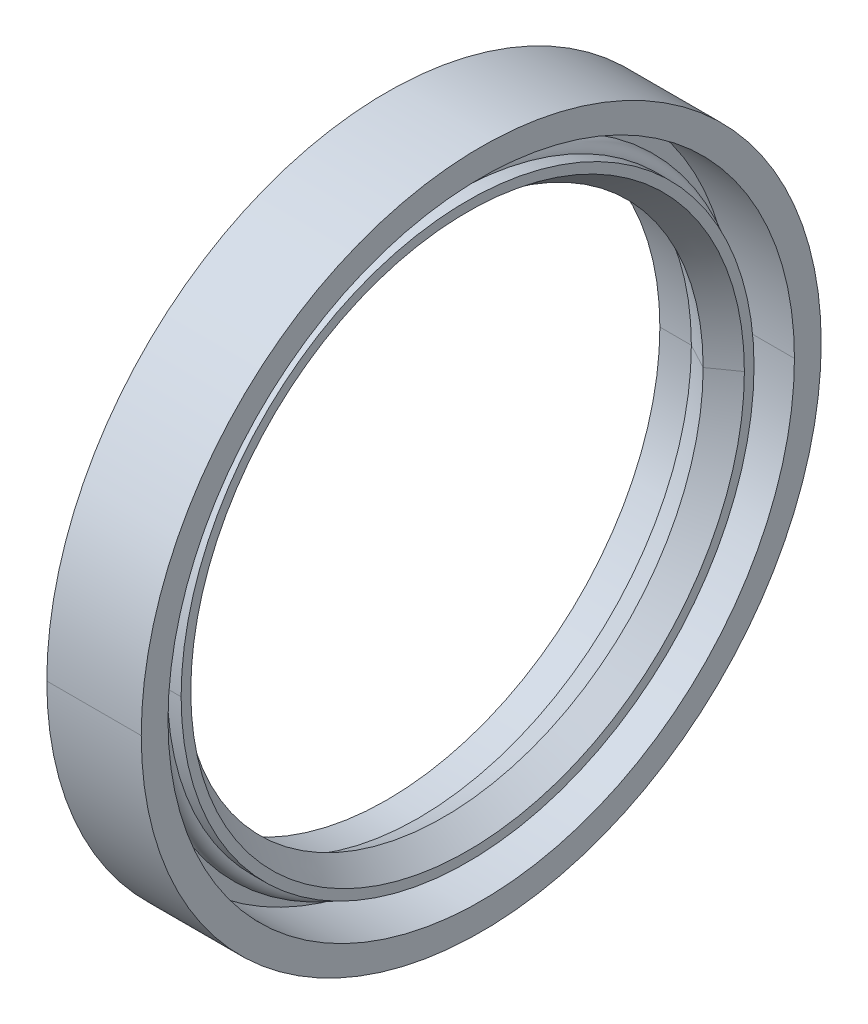
ISO-10303-21;
HEADER;
FILE_DESCRIPTION(('STEP AP214'),'2;1');
FILE_NAME('part.step','',(''),(''),'','','');
FILE_SCHEMA(('AUTOMOTIVE_DESIGN { 1 0 10303 214 1 1 1 1 }'));
ENDSEC;
DATA;
#1=APPLICATION_CONTEXT('core data for automotive mechanical design processes');
#2=APPLICATION_PROTOCOL_DEFINITION('international standard','automotive_design',2000,#1);
#3=PRODUCT_CONTEXT('',#1,'mechanical');
#4=PRODUCT('Part','Part','',(#3));
#5=PRODUCT_RELATED_PRODUCT_CATEGORY('part','',(#4));
#6=PRODUCT_DEFINITION_FORMATION('','',#4);
#7=PRODUCT_DEFINITION_CONTEXT('part definition',#1,'design');
#8=PRODUCT_DEFINITION('design','',#6,#7);
#9=PRODUCT_DEFINITION_SHAPE('','',#8);
#10=(LENGTH_UNIT() NAMED_UNIT(*) SI_UNIT(.MILLI.,.METRE.));
#11=(NAMED_UNIT(*) PLANE_ANGLE_UNIT() SI_UNIT($,.RADIAN.));
#12=(NAMED_UNIT(*) SI_UNIT($,.STERADIAN.) SOLID_ANGLE_UNIT());
#13=UNCERTAINTY_MEASURE_WITH_UNIT(LENGTH_MEASURE(1.E-05),#10,'distance_accuracy_value','');
#14=(GEOMETRIC_REPRESENTATION_CONTEXT(3) GLOBAL_UNCERTAINTY_ASSIGNED_CONTEXT((#13)) GLOBAL_UNIT_ASSIGNED_CONTEXT((#10,
#11,#12)) REPRESENTATION_CONTEXT('',''));
#15=CARTESIAN_POINT('',(0.,0.,0.));
#16=DIRECTION('',(0.,0.,1.));
#17=DIRECTION('',(1.,0.,0.));
#18=AXIS2_PLACEMENT_3D('',#15,#16,#17);
#19=CARTESIAN_POINT('',(10.,0.,0.));
#20=DIRECTION('',(1.,0.,0.));
#21=DIRECTION('',(0.,1.,0.));
#22=AXIS2_PLACEMENT_3D('',#19,#20,#21);
#23=CYLINDRICAL_SURFACE('',#22,36.);
#24=DIRECTION('',(1.,0.,0.));
#25=VECTOR('',#24,1.);
#26=CARTESIAN_POINT('',(0.,0.,36.));
#27=LINE('',#26,#25);
#28=CARTESIAN_POINT('',(0.,0.,36.));
#29=VERTEX_POINT('',#28);
#30=CARTESIAN_POINT('',(10.,0.,36.));
#31=VERTEX_POINT('',#30);
#32=EDGE_CURVE('E11',#29,#31,#27,.T.);
#33=ORIENTED_EDGE('',*,*,#32,.F.);
#34=CARTESIAN_POINT('',(0.,0.,0.));
#35=DIRECTION('',(1.,0.,0.));
#36=DIRECTION('',(0.,0.,-1.));
#37=AXIS2_PLACEMENT_3D('',#34,#35,#36);
#38=CIRCLE('',#37,36.);
#39=CARTESIAN_POINT('',(0.,0.,-36.));
#40=VERTEX_POINT('',#39);
#41=EDGE_CURVE('E25',#29,#40,#38,.T.);
#42=ORIENTED_EDGE('',*,*,#41,.T.);
#43=DIRECTION('',(1.,0.,0.));
#44=VECTOR('',#43,1.);
#45=CARTESIAN_POINT('',(0.,0.,-36.));
#46=LINE('',#45,#44);
#47=CARTESIAN_POINT('',(10.,0.,-36.));
#48=VERTEX_POINT('',#47);
#49=EDGE_CURVE('E320',#40,#48,#46,.T.);
#50=ORIENTED_EDGE('',*,*,#49,.T.);
#51=CARTESIAN_POINT('',(10.,0.,0.));
#52=DIRECTION('',(1.,0.,0.));
#53=DIRECTION('',(0.,0.,-1.));
#54=AXIS2_PLACEMENT_3D('',#51,#52,#53);
#55=CIRCLE('',#54,36.);
#56=EDGE_CURVE('E315',#31,#48,#55,.T.);
#57=ORIENTED_EDGE('',*,*,#56,.F.);
#58=EDGE_LOOP('',(#33,#42,#50,#57));
#59=FACE_BOUND('',#58,.T.);
#60=ADVANCED_FACE('F17',(#59),#23,.T.);
#61=CARTESIAN_POINT('',(10.,33.166666666667,0.));
#62=DIRECTION('',(1.,0.,0.));
#63=DIRECTION('',(0.,0.,-1.));
#64=AXIS2_PLACEMENT_3D('',#61,#62,#63);
#65=PLANE('',#64);
#66=CARTESIAN_POINT('',(10.,0.,0.));
#67=DIRECTION('',(1.,0.,0.));
#68=DIRECTION('',(0.,0.,-1.));
#69=AXIS2_PLACEMENT_3D('',#66,#67,#68);
#70=CIRCLE('',#69,36.);
#71=EDGE_CURVE('E310',#48,#31,#70,.T.);
#72=ORIENTED_EDGE('',*,*,#71,.T.);
#73=ORIENTED_EDGE('',*,*,#56,.T.);
#74=EDGE_LOOP('',(#72,#73));
#75=FACE_BOUND('',#74,.T.);
#76=CARTESIAN_POINT('',(10.,0.,0.));
#77=DIRECTION('',(1.,0.,0.));
#78=DIRECTION('',(0.,0.,-1.));
#79=AXIS2_PLACEMENT_3D('',#76,#77,#78);
#80=CIRCLE('',#79,33.166666666667);
#81=CARTESIAN_POINT('',(10.,0.,33.166666666667));
#82=VERTEX_POINT('',#81);
#83=CARTESIAN_POINT('',(10.,0.,-33.166666666667));
#84=VERTEX_POINT('',#83);
#85=EDGE_CURVE('E305',#82,#84,#80,.T.);
#86=ORIENTED_EDGE('',*,*,#85,.F.);
#87=CARTESIAN_POINT('',(10.,0.,0.));
#88=DIRECTION('',(1.,0.,0.));
#89=DIRECTION('',(0.,0.,-1.));
#90=AXIS2_PLACEMENT_3D('',#87,#88,#89);
#91=CIRCLE('',#90,33.166666666667);
#92=EDGE_CURVE('E300',#84,#82,#91,.T.);
#93=ORIENTED_EDGE('',*,*,#92,.F.);
#94=EDGE_LOOP('',(#86,#93));
#95=FACE_BOUND('',#94,.T.);
#96=ADVANCED_FACE('F333',(#75,#95),#65,.T.);
#97=CARTESIAN_POINT('',(10.,0.,0.));
#98=DIRECTION('',(1.,0.,0.));
#99=DIRECTION('',(0.,-1.,0.));
#100=AXIS2_PLACEMENT_3D('',#97,#98,#99);
#101=CYLINDRICAL_SURFACE('',#100,33.166666666667);
#102=DIRECTION('',(1.,0.,0.));
#103=VECTOR('',#102,1.);
#104=CARTESIAN_POINT('',(3.3333333333333,0.,33.166666666667));
#105=LINE('',#104,#103);
#106=CARTESIAN_POINT('',(3.3333333333333,0.,33.166666666667));
#107=VERTEX_POINT('',#106);
#108=EDGE_CURVE('E295',#107,#82,#105,.T.);
#109=ORIENTED_EDGE('',*,*,#108,.F.);
#110=CARTESIAN_POINT('',(3.3333333333333,0.,0.));
#111=DIRECTION('',(1.,0.,0.));
#112=DIRECTION('',(0.,0.,-1.));
#113=AXIS2_PLACEMENT_3D('',#110,#111,#112);
#114=CIRCLE('',#113,33.166666666667);
#115=CARTESIAN_POINT('',(3.3333333333333,0.,-33.166666666667));
#116=VERTEX_POINT('',#115);
#117=EDGE_CURVE('E290',#116,#107,#114,.T.);
#118=ORIENTED_EDGE('',*,*,#117,.F.);
#119=DIRECTION('',(1.,0.,0.));
#120=VECTOR('',#119,1.);
#121=CARTESIAN_POINT('',(3.3333333333333,0.,-33.166666666667));
#122=LINE('',#121,#120);
#123=EDGE_CURVE('E285',#116,#84,#122,.T.);
#124=ORIENTED_EDGE('',*,*,#123,.T.);
#125=ORIENTED_EDGE('',*,*,#92,.T.);
#126=EDGE_LOOP('',(#109,#118,#124,#125));
#127=FACE_BOUND('',#126,.T.);
#128=ADVANCED_FACE('F336',(#127),#101,.F.);
#129=CARTESIAN_POINT('',(10.,0.,0.));
#130=DIRECTION('',(1.,0.,0.));
#131=DIRECTION('',(0.,1.,0.));
#132=AXIS2_PLACEMENT_3D('',#129,#130,#131);
#133=CYLINDRICAL_SURFACE('',#132,33.166666666667);
#134=ORIENTED_EDGE('',*,*,#108,.T.);
#135=ORIENTED_EDGE('',*,*,#85,.T.);
#136=ORIENTED_EDGE('',*,*,#123,.F.);
#137=CARTESIAN_POINT('',(3.3333333333333,0.,0.));
#138=DIRECTION('',(1.,0.,0.));
#139=DIRECTION('',(0.,0.,-1.));
#140=AXIS2_PLACEMENT_3D('',#137,#138,#139);
#141=CIRCLE('',#140,33.166666666667);
#142=EDGE_CURVE('E280',#107,#116,#141,.T.);
#143=ORIENTED_EDGE('',*,*,#142,.F.);
#144=EDGE_LOOP('',(#134,#135,#136,#143));
#145=FACE_BOUND('',#144,.T.);
#146=ADVANCED_FACE('F340',(#145),#133,.F.);
#147=CARTESIAN_POINT('',(3.3333333333333,30.333333333333,0.));
#148=DIRECTION('',(1.,0.,0.));
#149=DIRECTION('',(0.,0.,-1.));
#150=AXIS2_PLACEMENT_3D('',#147,#148,#149);
#151=PLANE('',#150);
#152=ORIENTED_EDGE('',*,*,#117,.T.);
#153=ORIENTED_EDGE('',*,*,#142,.T.);
#154=EDGE_LOOP('',(#152,#153));
#155=FACE_BOUND('',#154,.T.);
#156=CARTESIAN_POINT('',(3.3333333333333,0.,0.));
#157=DIRECTION('',(1.,0.,0.));
#158=DIRECTION('',(0.,0.,-1.));
#159=AXIS2_PLACEMENT_3D('',#156,#157,#158);
#160=CIRCLE('',#159,30.333333333333);
#161=CARTESIAN_POINT('',(3.3333333333333,0.,30.333333333333));
#162=VERTEX_POINT('',#161);
#163=CARTESIAN_POINT('',(3.3333333333333,0.,-30.333333333333));
#164=VERTEX_POINT('',#163);
#165=EDGE_CURVE('E275',#162,#164,#160,.T.);
#166=ORIENTED_EDGE('',*,*,#165,.F.);
#167=CARTESIAN_POINT('',(3.3333333333333,0.,0.));
#168=DIRECTION('',(1.,0.,0.));
#169=DIRECTION('',(0.,0.,-1.));
#170=AXIS2_PLACEMENT_3D('',#167,#168,#169);
#171=CIRCLE('',#170,30.333333333333);
#172=EDGE_CURVE('E270',#164,#162,#171,.T.);
#173=ORIENTED_EDGE('',*,*,#172,.F.);
#174=EDGE_LOOP('',(#166,#173));
#175=FACE_BOUND('',#174,.T.);
#176=ADVANCED_FACE('F343',(#155,#175),#151,.T.);
#177=CARTESIAN_POINT('',(10.,0.,0.));
#178=DIRECTION('',(1.,0.,0.));
#179=DIRECTION('',(0.,-1.,0.));
#180=AXIS2_PLACEMENT_3D('',#177,#178,#179);
#181=CYLINDRICAL_SURFACE('',#180,30.333333333333);
#182=DIRECTION('',(1.,0.,0.));
#183=VECTOR('',#182,1.);
#184=CARTESIAN_POINT('',(3.3333333333333,0.,30.333333333333));
#185=LINE('',#184,#183);
#186=CARTESIAN_POINT('',(4.888889,0.,30.333333333333));
#187=VERTEX_POINT('',#186);
#188=EDGE_CURVE('E266',#162,#187,#185,.T.);
#189=ORIENTED_EDGE('',*,*,#188,.T.);
#190=CARTESIAN_POINT('',(4.888889,0.,0.));
#191=DIRECTION('',(1.,0.,0.));
#192=DIRECTION('',(0.,0.,-1.));
#193=AXIS2_PLACEMENT_3D('',#190,#191,#192);
#194=CIRCLE('',#193,30.333333333333);
#195=CARTESIAN_POINT('',(4.888889,28.8487143276193,9.37351549603997));
#196=VERTEX_POINT('',#195);
#197=EDGE_CURVE('E261',#196,#187,#194,.T.);
#198=ORIENTED_EDGE('',*,*,#197,.F.);
#199=CARTESIAN_POINT('',(4.888889,0.,0.));
#200=DIRECTION('',(1.,0.,0.));
#201=DIRECTION('',(0.,0.,-1.));
#202=AXIS2_PLACEMENT_3D('',#199,#200,#201);
#203=CIRCLE('',#202,30.333333333333);
#204=CARTESIAN_POINT('',(4.888889,0.,-30.333333333333));
#205=VERTEX_POINT('',#204);
#206=EDGE_CURVE('E256',#205,#196,#203,.T.);
#207=ORIENTED_EDGE('',*,*,#206,.F.);
#208=DIRECTION('',(1.,0.,0.));
#209=VECTOR('',#208,1.);
#210=CARTESIAN_POINT('',(3.3333333333333,0.,-30.333333333333));
#211=LINE('',#210,#209);
#212=EDGE_CURVE('E251',#164,#205,#211,.T.);
#213=ORIENTED_EDGE('',*,*,#212,.F.);
#214=ORIENTED_EDGE('',*,*,#172,.T.);
#215=EDGE_LOOP('',(#189,#198,#207,#213,#214));
#216=FACE_BOUND('',#215,.T.);
#217=ADVANCED_FACE('F346',(#216),#181,.T.);
#218=CARTESIAN_POINT('',(10.,0.,0.));
#219=DIRECTION('',(1.,0.,0.));
#220=DIRECTION('',(0.,1.,0.));
#221=AXIS2_PLACEMENT_3D('',#218,#219,#220);
#222=CYLINDRICAL_SURFACE('',#221,30.333333333333);
#223=ORIENTED_EDGE('',*,*,#188,.F.);
#224=ORIENTED_EDGE('',*,*,#165,.T.);
#225=ORIENTED_EDGE('',*,*,#212,.T.);
#226=CARTESIAN_POINT('',(4.888889,0.,0.));
#227=DIRECTION('',(1.,0.,0.));
#228=DIRECTION('',(0.,0.,-1.));
#229=AXIS2_PLACEMENT_3D('',#226,#227,#228);
#230=CIRCLE('',#229,30.333333333333);
#231=CARTESIAN_POINT('',(4.888889,-28.8487143276193,-9.37351549603996));
#232=VERTEX_POINT('',#231);
#233=EDGE_CURVE('E246',#232,#205,#230,.T.);
#234=ORIENTED_EDGE('',*,*,#233,.F.);
#235=CARTESIAN_POINT('',(4.888889,0.,0.));
#236=DIRECTION('',(1.,0.,0.));
#237=DIRECTION('',(0.,0.,-1.));
#238=AXIS2_PLACEMENT_3D('',#235,#236,#237);
#239=CIRCLE('',#238,30.333333333333);
#240=EDGE_CURVE('E241',#187,#232,#239,.T.);
#241=ORIENTED_EDGE('',*,*,#240,.F.);
#242=EDGE_LOOP('',(#223,#224,#225,#234,#241));
#243=FACE_BOUND('',#242,.T.);
#244=ADVANCED_FACE('F352',(#243),#222,.T.);
#245=CARTESIAN_POINT('',(6.,0.,0.));
#246=DIRECTION('',(1.,0.,0.));
#247=DIRECTION('',(0.,0.309016994374947,-0.951056516295154));
#248=AXIS2_PLACEMENT_3D('',#245,#246,#247);
#249=TOROIDAL_SURFACE('',#248,30.333333333333,1.111111);
#250=CARTESIAN_POINT('',(6.,-28.8487143276193,-9.37351549603996));
#251=DIRECTION('',(0.,0.309016994374947,-0.951056516295154));
#252=DIRECTION('',(1.,0.,0.));
#253=AXIS2_PLACEMENT_3D('',#250,#251,#252);
#254=CIRCLE('',#253,1.111111);
#255=CARTESIAN_POINT('',(7.111111,-28.8487143276193,-9.37351549603996));
#256=VERTEX_POINT('',#255);
#257=EDGE_CURVE('E236',#256,#232,#254,.T.);
#258=ORIENTED_EDGE('',*,*,#257,.F.);
#259=CARTESIAN_POINT('',(7.111111,0.,0.));
#260=DIRECTION('',(1.,0.,0.));
#261=DIRECTION('',(0.,0.,-1.));
#262=AXIS2_PLACEMENT_3D('',#259,#260,#261);
#263=CIRCLE('',#262,30.333333333333);
#264=CARTESIAN_POINT('',(7.111111,0.,30.333333333333));
#265=VERTEX_POINT('',#264);
#266=EDGE_CURVE('E231',#265,#256,#263,.T.);
#267=ORIENTED_EDGE('',*,*,#266,.F.);
#268=CARTESIAN_POINT('',(7.111111,0.,0.));
#269=DIRECTION('',(1.,0.,0.));
#270=DIRECTION('',(0.,0.,-1.));
#271=AXIS2_PLACEMENT_3D('',#268,#269,#270);
#272=CIRCLE('',#271,30.333333333333);
#273=CARTESIAN_POINT('',(7.111111,28.8487143276193,9.37351549603997));
#274=VERTEX_POINT('',#273);
#275=EDGE_CURVE('E226',#274,#265,#272,.T.);
#276=ORIENTED_EDGE('',*,*,#275,.F.);
#277=CARTESIAN_POINT('',(6.,28.8487143276193,9.37351549603997));
#278=DIRECTION('',(0.,-0.309016994374947,0.951056516295154));
#279=DIRECTION('',(1.,0.,0.));
#280=AXIS2_PLACEMENT_3D('',#277,#278,#279);
#281=CIRCLE('',#280,1.111111);
#282=EDGE_CURVE('E221',#274,#196,#281,.T.);
#283=ORIENTED_EDGE('',*,*,#282,.T.);
#284=ORIENTED_EDGE('',*,*,#197,.T.);
#285=ORIENTED_EDGE('',*,*,#240,.T.);
#286=EDGE_LOOP('',(#258,#267,#276,#283,#284,#285));
#287=FACE_BOUND('',#286,.T.);
#288=ADVANCED_FACE('F359',(#287),#249,.T.);
#289=CARTESIAN_POINT('',(6.,0.,0.));
#290=DIRECTION('',(1.,0.,0.));
#291=DIRECTION('',(0.,-0.309016994374947,0.951056516295154));
#292=AXIS2_PLACEMENT_3D('',#289,#290,#291);
#293=TOROIDAL_SURFACE('',#292,30.333333333333,1.111111);
#294=ORIENTED_EDGE('',*,*,#257,.T.);
#295=ORIENTED_EDGE('',*,*,#233,.T.);
#296=ORIENTED_EDGE('',*,*,#206,.T.);
#297=ORIENTED_EDGE('',*,*,#282,.F.);
#298=CARTESIAN_POINT('',(7.111111,0.,0.));
#299=DIRECTION('',(1.,0.,0.));
#300=DIRECTION('',(0.,0.,-1.));
#301=AXIS2_PLACEMENT_3D('',#298,#299,#300);
#302=CIRCLE('',#301,30.333333333333);
#303=CARTESIAN_POINT('',(7.111111,0.,-30.333333333333));
#304=VERTEX_POINT('',#303);
#305=EDGE_CURVE('E216',#304,#274,#302,.T.);
#306=ORIENTED_EDGE('',*,*,#305,.F.);
#307=CARTESIAN_POINT('',(7.111111,0.,0.));
#308=DIRECTION('',(1.,0.,0.));
#309=DIRECTION('',(0.,0.,-1.));
#310=AXIS2_PLACEMENT_3D('',#307,#308,#309);
#311=CIRCLE('',#310,30.333333333333);
#312=EDGE_CURVE('E211',#256,#304,#311,.T.);
#313=ORIENTED_EDGE('',*,*,#312,.F.);
#314=EDGE_LOOP('',(#294,#295,#296,#297,#306,#313));
#315=FACE_BOUND('',#314,.T.);
#316=ADVANCED_FACE('F355',(#315),#293,.T.);
#317=CARTESIAN_POINT('',(10.,0.,0.));
#318=DIRECTION('',(1.,0.,0.));
#319=DIRECTION('',(0.,1.,0.));
#320=AXIS2_PLACEMENT_3D('',#317,#318,#319);
#321=CYLINDRICAL_SURFACE('',#320,30.333333333333);
#322=DIRECTION('',(1.,0.,0.));
#323=VECTOR('',#322,1.);
#324=CARTESIAN_POINT('',(7.111111,0.,30.333333333333));
#325=LINE('',#324,#323);
#326=CARTESIAN_POINT('',(8.5555555,0.,30.333333333333));
#327=VERTEX_POINT('',#326);
#328=EDGE_CURVE('E206',#265,#327,#325,.T.);
#329=ORIENTED_EDGE('',*,*,#328,.F.);
#330=ORIENTED_EDGE('',*,*,#266,.T.);
#331=ORIENTED_EDGE('',*,*,#312,.T.);
#332=DIRECTION('',(1.,0.,0.));
#333=VECTOR('',#332,1.);
#334=CARTESIAN_POINT('',(7.111111,0.,-30.333333333333));
#335=LINE('',#334,#333);
#336=CARTESIAN_POINT('',(8.5555555,0.,-30.333333333333));
#337=VERTEX_POINT('',#336);
#338=EDGE_CURVE('E202',#304,#337,#335,.T.);
#339=ORIENTED_EDGE('',*,*,#338,.T.);
#340=CARTESIAN_POINT('',(8.5555555,0.,0.));
#341=DIRECTION('',(1.,0.,0.));
#342=DIRECTION('',(0.,0.,-1.));
#343=AXIS2_PLACEMENT_3D('',#340,#341,#342);
#344=CIRCLE('',#343,30.333333333333);
#345=EDGE_CURVE('E197',#327,#337,#344,.T.);
#346=ORIENTED_EDGE('',*,*,#345,.F.);
#347=EDGE_LOOP('',(#329,#330,#331,#339,#346));
#348=FACE_BOUND('',#347,.T.);
#349=ADVANCED_FACE('F364',(#348),#321,.T.);
#350=CARTESIAN_POINT('',(8.5555555,29.310185145833,0.));
#351=DIRECTION('',(1.,0.,0.));
#352=DIRECTION('',(0.,0.,-1.));
#353=AXIS2_PLACEMENT_3D('',#350,#351,#352);
#354=PLANE('',#353);
#355=CARTESIAN_POINT('',(8.5555555,0.,0.));
#356=DIRECTION('',(1.,0.,0.));
#357=DIRECTION('',(0.,0.,-1.));
#358=AXIS2_PLACEMENT_3D('',#355,#356,#357);
#359=CIRCLE('',#358,30.333333333333);
#360=EDGE_CURVE('E192',#337,#327,#359,.T.);
#361=ORIENTED_EDGE('',*,*,#360,.T.);
#362=ORIENTED_EDGE('',*,*,#345,.T.);
#363=EDGE_LOOP('',(#361,#362));
#364=FACE_BOUND('',#363,.T.);
#365=CARTESIAN_POINT('',(8.5555555,0.,0.));
#366=DIRECTION('',(1.,0.,0.));
#367=DIRECTION('',(0.,0.,-1.));
#368=AXIS2_PLACEMENT_3D('',#365,#366,#367);
#369=CIRCLE('',#368,29.310185145833);
#370=CARTESIAN_POINT('',(8.5555555,0.,29.310185145833));
#371=VERTEX_POINT('',#370);
#372=CARTESIAN_POINT('',(8.5555555,0.,-29.310185145833));
#373=VERTEX_POINT('',#372);
#374=EDGE_CURVE('E187',#371,#373,#369,.T.);
#375=ORIENTED_EDGE('',*,*,#374,.F.);
#376=CARTESIAN_POINT('',(8.5555555,0.,0.));
#377=DIRECTION('',(1.,0.,0.));
#378=DIRECTION('',(0.,0.,-1.));
#379=AXIS2_PLACEMENT_3D('',#376,#377,#378);
#380=CIRCLE('',#379,29.310185145833);
#381=EDGE_CURVE('E182',#373,#371,#380,.T.);
#382=ORIENTED_EDGE('',*,*,#381,.F.);
#383=EDGE_LOOP('',(#375,#382));
#384=FACE_BOUND('',#383,.T.);
#385=ADVANCED_FACE('F368',(#364,#384),#354,.T.);
#386=CARTESIAN_POINT('',(6.,0.,0.));
#387=DIRECTION('',(1.,0.,0.));
#388=DIRECTION('',(0.,-1.,0.));
#389=AXIS2_PLACEMENT_3D('',#386,#387,#388);
#390=CONICAL_SURFACE('',#389,27.5,0.616296937395985);
#391=DIRECTION('',(0.816024481101705,0.,0.578017340780268));
#392=VECTOR('',#391,1.);
#393=CARTESIAN_POINT('',(6.,0.,27.5));
#394=LINE('',#393,#392);
#395=CARTESIAN_POINT('',(6.,0.,27.5));
#396=VERTEX_POINT('',#395);
#397=EDGE_CURVE('E177',#396,#371,#394,.T.);
#398=ORIENTED_EDGE('',*,*,#397,.F.);
#399=CARTESIAN_POINT('',(6.,0.,0.));
#400=DIRECTION('',(1.,0.,0.));
#401=DIRECTION('',(0.,0.,-1.));
#402=AXIS2_PLACEMENT_3D('',#399,#400,#401);
#403=CIRCLE('',#402,27.5);
#404=CARTESIAN_POINT('',(6.,0.,-27.5));
#405=VERTEX_POINT('',#404);
#406=EDGE_CURVE('E172',#405,#396,#403,.T.);
#407=ORIENTED_EDGE('',*,*,#406,.F.);
#408=DIRECTION('',(0.816024481101705,0.,-0.578017340780268));
#409=VECTOR('',#408,1.);
#410=CARTESIAN_POINT('',(6.,0.,-27.5));
#411=LINE('',#410,#409);
#412=EDGE_CURVE('E167',#405,#373,#411,.T.);
#413=ORIENTED_EDGE('',*,*,#412,.T.);
#414=ORIENTED_EDGE('',*,*,#381,.T.);
#415=EDGE_LOOP('',(#398,#407,#413,#414));
#416=FACE_BOUND('',#415,.T.);
#417=ADVANCED_FACE('F371',(#416),#390,.F.);
#418=CARTESIAN_POINT('',(6.,0.,0.));
#419=DIRECTION('',(1.,0.,0.));
#420=DIRECTION('',(0.,1.,0.));
#421=AXIS2_PLACEMENT_3D('',#418,#419,#420);
#422=CONICAL_SURFACE('',#421,27.5,0.616296937395985);
#423=ORIENTED_EDGE('',*,*,#397,.T.);
#424=ORIENTED_EDGE('',*,*,#374,.T.);
#425=ORIENTED_EDGE('',*,*,#412,.F.);
#426=CARTESIAN_POINT('',(6.,0.,0.));
#427=DIRECTION('',(1.,0.,0.));
#428=DIRECTION('',(0.,0.,-1.));
#429=AXIS2_PLACEMENT_3D('',#426,#427,#428);
#430=CIRCLE('',#429,27.5);
#431=EDGE_CURVE('E162',#396,#405,#430,.T.);
#432=ORIENTED_EDGE('',*,*,#431,.F.);
#433=EDGE_LOOP('',(#423,#424,#425,#432));
#434=FACE_BOUND('',#433,.T.);
#435=ADVANCED_FACE('F376',(#434),#422,.F.);
#436=CARTESIAN_POINT('',(3.3333333333333,0.,0.));
#437=DIRECTION('',(-1.,0.,0.));
#438=DIRECTION('',(0.,1.,0.));
#439=AXIS2_PLACEMENT_3D('',#436,#437,#438);
#440=CONICAL_SURFACE('',#439,28.916666666667,0.488333951056498);
#441=DIRECTION('',(-0.883115719457367,0.,-0.469155225961831));
#442=VECTOR('',#441,1.);
#443=CARTESIAN_POINT('',(6.,0.,-27.5));
#444=LINE('',#443,#442);
#445=CARTESIAN_POINT('',(3.3333333333333,0.,-28.916666666667));
#446=VERTEX_POINT('',#445);
#447=EDGE_CURVE('E158',#405,#446,#444,.T.);
#448=ORIENTED_EDGE('',*,*,#447,.T.);
#449=CARTESIAN_POINT('',(3.3333333333333,0.,0.));
#450=DIRECTION('',(1.,0.,0.));
#451=DIRECTION('',(0.,0.,-1.));
#452=AXIS2_PLACEMENT_3D('',#449,#450,#451);
#453=CIRCLE('',#452,28.916666666667);
#454=CARTESIAN_POINT('',(3.3333333333333,0.,28.916666666667));
#455=VERTEX_POINT('',#454);
#456=EDGE_CURVE('E129',#455,#446,#453,.T.);
#457=ORIENTED_EDGE('',*,*,#456,.F.);
#458=DIRECTION('',(-0.883115719457367,0.,0.469155225961831));
#459=VECTOR('',#458,1.);
#460=CARTESIAN_POINT('',(6.,0.,27.5));
#461=LINE('',#460,#459);
#462=EDGE_CURVE('E150',#396,#455,#461,.T.);
#463=ORIENTED_EDGE('',*,*,#462,.F.);
#464=ORIENTED_EDGE('',*,*,#431,.T.);
#465=EDGE_LOOP('',(#448,#457,#463,#464));
#466=FACE_BOUND('',#465,.T.);
#467=ADVANCED_FACE('F381',(#466),#440,.F.);
#468=CARTESIAN_POINT('',(3.3333333333333,0.,0.));
#469=DIRECTION('',(-1.,0.,0.));
#470=DIRECTION('',(0.,-1.,0.));
#471=AXIS2_PLACEMENT_3D('',#468,#469,#470);
#472=CONICAL_SURFACE('',#471,28.916666666667,0.488333951056498);
#473=ORIENTED_EDGE('',*,*,#447,.F.);
#474=ORIENTED_EDGE('',*,*,#406,.T.);
#475=ORIENTED_EDGE('',*,*,#462,.T.);
#476=CARTESIAN_POINT('',(3.3333333333333,0.,0.));
#477=DIRECTION('',(1.,0.,0.));
#478=DIRECTION('',(0.,0.,-1.));
#479=AXIS2_PLACEMENT_3D('',#476,#477,#478);
#480=CIRCLE('',#479,28.916666666667);
#481=EDGE_CURVE('E146',#446,#455,#480,.T.);
#482=ORIENTED_EDGE('',*,*,#481,.F.);
#483=EDGE_LOOP('',(#473,#474,#475,#482));
#484=FACE_BOUND('',#483,.T.);
#485=ADVANCED_FACE('F384',(#484),#472,.F.);
#486=CARTESIAN_POINT('',(10.,0.,0.));
#487=DIRECTION('',(1.,0.,0.));
#488=DIRECTION('',(0.,-1.,0.));
#489=AXIS2_PLACEMENT_3D('',#486,#487,#488);
#490=CYLINDRICAL_SURFACE('',#489,28.916666666667);
#491=DIRECTION('',(1.,0.,0.));
#492=VECTOR('',#491,1.);
#493=CARTESIAN_POINT('',(0.,0.,28.916666666667));
#494=LINE('',#493,#492);
#495=CARTESIAN_POINT('',(0.,0.,28.916666666667));
#496=VERTEX_POINT('',#495);
#497=EDGE_CURVE('E121',#496,#455,#494,.T.);
#498=ORIENTED_EDGE('',*,*,#497,.F.);
#499=CARTESIAN_POINT('',(0.,0.,0.));
#500=DIRECTION('',(1.,0.,0.));
#501=DIRECTION('',(0.,0.,-1.));
#502=AXIS2_PLACEMENT_3D('',#499,#500,#501);
#503=CIRCLE('',#502,28.916666666667);
#504=CARTESIAN_POINT('',(0.,0.,-28.916666666667));
#505=VERTEX_POINT('',#504);
#506=EDGE_CURVE('E114',#505,#496,#503,.T.);
#507=ORIENTED_EDGE('',*,*,#506,.F.);
#508=DIRECTION('',(1.,0.,0.));
#509=VECTOR('',#508,1.);
#510=CARTESIAN_POINT('',(0.,0.,-28.916666666667));
#511=LINE('',#510,#509);
#512=EDGE_CURVE('E118',#505,#446,#511,.T.);
#513=ORIENTED_EDGE('',*,*,#512,.T.);
#514=ORIENTED_EDGE('',*,*,#481,.T.);
#515=EDGE_LOOP('',(#498,#507,#513,#514));
#516=FACE_BOUND('',#515,.T.);
#517=ADVANCED_FACE('F116',(#516),#490,.F.);
#518=CARTESIAN_POINT('',(10.,0.,0.));
#519=DIRECTION('',(1.,0.,0.));
#520=DIRECTION('',(0.,1.,0.));
#521=AXIS2_PLACEMENT_3D('',#518,#519,#520);
#522=CYLINDRICAL_SURFACE('',#521,28.916666666667);
#523=ORIENTED_EDGE('',*,*,#497,.T.);
#524=ORIENTED_EDGE('',*,*,#456,.T.);
#525=ORIENTED_EDGE('',*,*,#512,.F.);
#526=CARTESIAN_POINT('',(0.,0.,0.));
#527=DIRECTION('',(1.,0.,0.));
#528=DIRECTION('',(0.,0.,-1.));
#529=AXIS2_PLACEMENT_3D('',#526,#527,#528);
#530=CIRCLE('',#529,28.916666666667);
#531=EDGE_CURVE('E128',#496,#505,#530,.T.);
#532=ORIENTED_EDGE('',*,*,#531,.F.);
#533=EDGE_LOOP('',(#523,#524,#525,#532));
#534=FACE_BOUND('',#533,.T.);
#535=ADVANCED_FACE('F127',(#534),#522,.F.);
#536=CARTESIAN_POINT('',(0.,36.,0.));
#537=DIRECTION('',(-1.,0.,0.));
#538=DIRECTION('',(0.,0.,1.));
#539=AXIS2_PLACEMENT_3D('',#536,#537,#538);
#540=PLANE('',#539);
#541=ORIENTED_EDGE('',*,*,#506,.T.);
#542=ORIENTED_EDGE('',*,*,#531,.T.);
#543=EDGE_LOOP('',(#541,#542));
#544=FACE_BOUND('',#543,.T.);
#545=ORIENTED_EDGE('',*,*,#41,.F.);
#546=CARTESIAN_POINT('',(0.,0.,0.));
#547=DIRECTION('',(1.,0.,0.));
#548=DIRECTION('',(0.,0.,-1.));
#549=AXIS2_PLACEMENT_3D('',#546,#547,#548);
#550=CIRCLE('',#549,36.);
#551=EDGE_CURVE('E133',#40,#29,#550,.T.);
#552=ORIENTED_EDGE('',*,*,#551,.F.);
#553=EDGE_LOOP('',(#545,#552));
#554=FACE_BOUND('',#553,.T.);
#555=ADVANCED_FACE('F131',(#544,#554),#540,.T.);
#556=CARTESIAN_POINT('',(10.,0.,0.));
#557=DIRECTION('',(1.,0.,0.));
#558=DIRECTION('',(0.,-1.,0.));
#559=AXIS2_PLACEMENT_3D('',#556,#557,#558);
#560=CYLINDRICAL_SURFACE('',#559,36.);
#561=ORIENTED_EDGE('',*,*,#32,.T.);
#562=ORIENTED_EDGE('',*,*,#71,.F.);
#563=ORIENTED_EDGE('',*,*,#49,.F.);
#564=ORIENTED_EDGE('',*,*,#551,.T.);
#565=EDGE_LOOP('',(#561,#562,#563,#564));
#566=FACE_BOUND('',#565,.T.);
#567=ADVANCED_FACE('F331',(#566),#560,.T.);
#568=CARTESIAN_POINT('',(10.,0.,0.));
#569=DIRECTION('',(1.,0.,0.));
#570=DIRECTION('',(0.,-1.,0.));
#571=AXIS2_PLACEMENT_3D('',#568,#569,#570);
#572=CYLINDRICAL_SURFACE('',#571,30.333333333333);
#573=ORIENTED_EDGE('',*,*,#328,.T.);
#574=ORIENTED_EDGE('',*,*,#360,.F.);
#575=ORIENTED_EDGE('',*,*,#338,.F.);
#576=ORIENTED_EDGE('',*,*,#305,.T.);
#577=ORIENTED_EDGE('',*,*,#275,.T.);
#578=EDGE_LOOP('',(#573,#574,#575,#576,#577));
#579=FACE_BOUND('',#578,.T.);
#580=ADVANCED_FACE('F366',(#579),#572,.T.);
#581=CLOSED_SHELL('',(#60,#96,#128,#146,#176,#217,#244,#288,#316,#349,#385,#417,#435,#467,#485,
#517,#535,#555,#567,#580));
#582=MANIFOLD_SOLID_BREP('B1',#581);
#583=ADVANCED_BREP_SHAPE_REPRESENTATION('',(#18,#582),#14);
#584=SHAPE_DEFINITION_REPRESENTATION(#9,#583);
ENDSEC;
END-ISO-10303-21;
